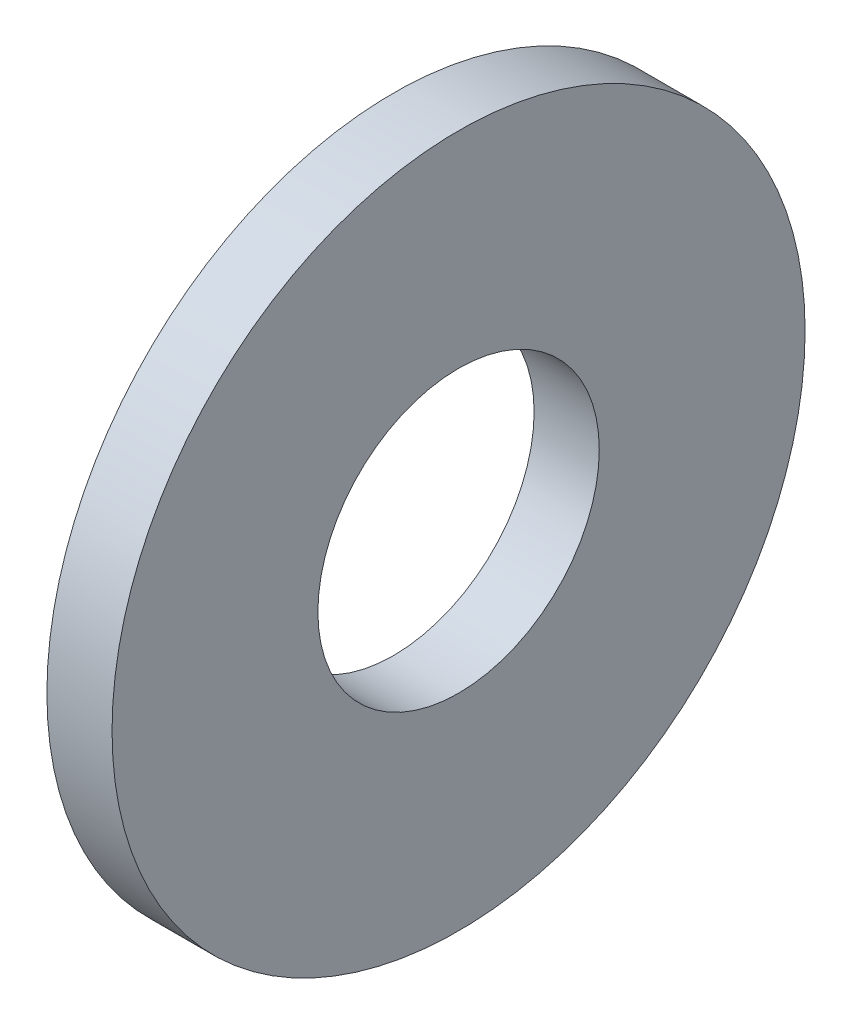
ISO-10303-21;
HEADER;
FILE_DESCRIPTION(('STEP AP214'),'2;1');
FILE_NAME('part.step','',(''),(''),'','','');
FILE_SCHEMA(('AUTOMOTIVE_DESIGN { 1 0 10303 214 1 1 1 1 }'));
ENDSEC;
DATA;
#1=APPLICATION_CONTEXT('core data for automotive mechanical design processes');
#2=APPLICATION_PROTOCOL_DEFINITION('international standard','automotive_design',2000,#1);
#3=PRODUCT_CONTEXT('',#1,'mechanical');
#4=PRODUCT('Part','Part','',(#3));
#5=PRODUCT_RELATED_PRODUCT_CATEGORY('part','',(#4));
#6=PRODUCT_DEFINITION_FORMATION('','',#4);
#7=PRODUCT_DEFINITION_CONTEXT('part definition',#1,'design');
#8=PRODUCT_DEFINITION('design','',#6,#7);
#9=PRODUCT_DEFINITION_SHAPE('','',#8);
#10=(LENGTH_UNIT() NAMED_UNIT(*) SI_UNIT(.MILLI.,.METRE.));
#11=(NAMED_UNIT(*) PLANE_ANGLE_UNIT() SI_UNIT($,.RADIAN.));
#12=(NAMED_UNIT(*) SI_UNIT($,.STERADIAN.) SOLID_ANGLE_UNIT());
#13=UNCERTAINTY_MEASURE_WITH_UNIT(LENGTH_MEASURE(1.E-05),#10,'distance_accuracy_value','');
#14=(GEOMETRIC_REPRESENTATION_CONTEXT(3) GLOBAL_UNCERTAINTY_ASSIGNED_CONTEXT((#13)) GLOBAL_UNIT_ASSIGNED_CONTEXT((#10,
#11,#12)) REPRESENTATION_CONTEXT('',''));
#15=CARTESIAN_POINT('',(0.,0.,0.));
#16=DIRECTION('',(0.,0.,1.));
#17=DIRECTION('',(1.,0.,0.));
#18=AXIS2_PLACEMENT_3D('',#15,#16,#17);
#19=CARTESIAN_POINT('',(1.1938,0.,0.));
#20=DIRECTION('',(1.,0.,0.));
#21=DIRECTION('',(0.,0.,-1.));
#22=AXIS2_PLACEMENT_3D('',#19,#20,#21);
#23=PLANE('',#22);
#24=CARTESIAN_POINT('',(1.1938,0.,0.));
#25=DIRECTION('',(1.,0.,0.));
#26=DIRECTION('',(0.,0.,-1.));
#27=AXIS2_PLACEMENT_3D('',#24,#25,#26);
#28=CIRCLE('',#27,6.35);
#29=CARTESIAN_POINT('',(1.1938,0.,-6.35));
#30=VERTEX_POINT('',#29);
#31=EDGE_CURVE('E10',#30,#30,#28,.T.);
#32=ORIENTED_EDGE('',*,*,#31,.T.);
#33=EDGE_LOOP('',(#32));
#34=FACE_BOUND('',#33,.T.);
#35=CARTESIAN_POINT('',(1.1938,0.,0.));
#36=DIRECTION('',(1.,0.,0.));
#37=DIRECTION('',(0.,0.,-1.));
#38=AXIS2_PLACEMENT_3D('',#35,#36,#37);
#39=CIRCLE('',#38,2.5781);
#40=CARTESIAN_POINT('',(1.1938,0.,-2.5781));
#41=VERTEX_POINT('',#40);
#42=EDGE_CURVE('E43',#41,#41,#39,.T.);
#43=ORIENTED_EDGE('',*,*,#42,.F.);
#44=EDGE_LOOP('',(#43));
#45=FACE_BOUND('',#44,.T.);
#46=ADVANCED_FACE('F32',(#34,#45),#23,.T.);
#47=CARTESIAN_POINT('',(0.,0.,0.));
#48=DIRECTION('',(1.,0.,0.));
#49=DIRECTION('',(0.,0.,-1.));
#50=AXIS2_PLACEMENT_3D('',#47,#48,#49);
#51=PLANE('',#50);
#52=CARTESIAN_POINT('',(0.,0.,0.));
#53=DIRECTION('',(1.,0.,0.));
#54=DIRECTION('',(0.,0.,-1.));
#55=AXIS2_PLACEMENT_3D('',#52,#53,#54);
#56=CIRCLE('',#55,6.35);
#57=CARTESIAN_POINT('',(0.,0.,-6.35));
#58=VERTEX_POINT('',#57);
#59=EDGE_CURVE('E36',#58,#58,#56,.T.);
#60=ORIENTED_EDGE('',*,*,#59,.F.);
#61=EDGE_LOOP('',(#60));
#62=FACE_BOUND('',#61,.T.);
#63=CARTESIAN_POINT('',(0.,0.,0.));
#64=DIRECTION('',(1.,0.,0.));
#65=DIRECTION('',(0.,0.,-1.));
#66=AXIS2_PLACEMENT_3D('',#63,#64,#65);
#67=CIRCLE('',#66,2.5781);
#68=CARTESIAN_POINT('',(0.,0.,-2.5781));
#69=VERTEX_POINT('',#68);
#70=EDGE_CURVE('E45',#69,#69,#67,.T.);
#71=ORIENTED_EDGE('',*,*,#70,.T.);
#72=EDGE_LOOP('',(#71));
#73=FACE_BOUND('',#72,.T.);
#74=ADVANCED_FACE('F55',(#62,#73),#51,.F.);
#75=CARTESIAN_POINT('',(1.1938,0.,0.));
#76=DIRECTION('',(-1.,0.,0.));
#77=DIRECTION('',(0.,0.,1.));
#78=AXIS2_PLACEMENT_3D('',#75,#76,#77);
#79=CYLINDRICAL_SURFACE('',#78,6.35);
#80=ORIENTED_EDGE('',*,*,#31,.F.);
#81=EDGE_LOOP('',(#80));
#82=FACE_BOUND('',#81,.T.);
#83=ORIENTED_EDGE('',*,*,#59,.T.);
#84=EDGE_LOOP('',(#83));
#85=FACE_BOUND('',#84,.T.);
#86=ADVANCED_FACE('F34',(#82,#85),#79,.T.);
#87=CARTESIAN_POINT('',(1.1938,0.,0.));
#88=DIRECTION('',(-1.,0.,0.));
#89=DIRECTION('',(0.,0.,1.));
#90=AXIS2_PLACEMENT_3D('',#87,#88,#89);
#91=CYLINDRICAL_SURFACE('',#90,2.5781);
#92=ORIENTED_EDGE('',*,*,#42,.T.);
#93=EDGE_LOOP('',(#92));
#94=FACE_BOUND('',#93,.T.);
#95=ORIENTED_EDGE('',*,*,#70,.F.);
#96=EDGE_LOOP('',(#95));
#97=FACE_BOUND('',#96,.T.);
#98=ADVANCED_FACE('F51',(#94,#97),#91,.F.);
#99=CLOSED_SHELL('',(#46,#74,#86,#98));
#100=MANIFOLD_SOLID_BREP('B2',#99);
#101=ADVANCED_BREP_SHAPE_REPRESENTATION('',(#18,#100),#14);
#102=SHAPE_DEFINITION_REPRESENTATION(#9,#101);
ENDSEC;
END-ISO-10303-21;
